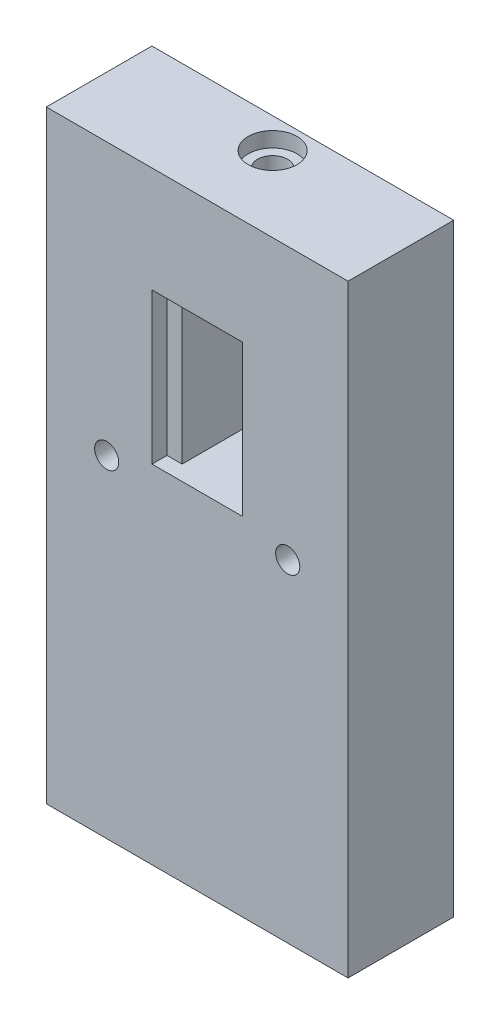
ISO-10303-21;
HEADER;
FILE_DESCRIPTION(('STEP AP214'),'2;1');
FILE_NAME('part.step','',(''),(''),'','','');
FILE_SCHEMA(('AUTOMOTIVE_DESIGN { 1 0 10303 214 1 1 1 1 }'));
ENDSEC;
DATA;
#1=APPLICATION_CONTEXT('core data for automotive mechanical design processes');
#2=APPLICATION_PROTOCOL_DEFINITION('international standard','automotive_design',2000,#1);
#3=PRODUCT_CONTEXT('',#1,'mechanical');
#4=PRODUCT('Part','Part','',(#3));
#5=PRODUCT_RELATED_PRODUCT_CATEGORY('part','',(#4));
#6=PRODUCT_DEFINITION_FORMATION('','',#4);
#7=PRODUCT_DEFINITION_CONTEXT('part definition',#1,'design');
#8=PRODUCT_DEFINITION('design','',#6,#7);
#9=PRODUCT_DEFINITION_SHAPE('','',#8);
#10=(LENGTH_UNIT() NAMED_UNIT(*) SI_UNIT(.MILLI.,.METRE.));
#11=(NAMED_UNIT(*) PLANE_ANGLE_UNIT() SI_UNIT($,.RADIAN.));
#12=(NAMED_UNIT(*) SI_UNIT($,.STERADIAN.) SOLID_ANGLE_UNIT());
#13=UNCERTAINTY_MEASURE_WITH_UNIT(LENGTH_MEASURE(1.E-05),#10,'distance_accuracy_value','');
#14=(GEOMETRIC_REPRESENTATION_CONTEXT(3) GLOBAL_UNCERTAINTY_ASSIGNED_CONTEXT((#13)) GLOBAL_UNIT_ASSIGNED_CONTEXT((#10,
#11,#12)) REPRESENTATION_CONTEXT('',''));
#15=CARTESIAN_POINT('',(0.,0.,0.));
#16=DIRECTION('',(0.,0.,1.));
#17=DIRECTION('',(1.,0.,0.));
#18=AXIS2_PLACEMENT_3D('',#15,#16,#17);
#19=CARTESIAN_POINT('',(0.,-100.,10.));
#20=DIRECTION('',(0.,1.,0.));
#21=DIRECTION('',(0.,0.,1.));
#22=AXIS2_PLACEMENT_3D('',#19,#20,#21);
#23=CYLINDRICAL_SURFACE('',#22,5.);
#24=CARTESIAN_POINT('',(0.,15.,10.));
#25=DIRECTION('',(0.,-1.,0.));
#26=DIRECTION('',(1.,0.,0.));
#27=AXIS2_PLACEMENT_3D('',#24,#25,#26);
#28=CIRCLE('',#27,5.);
#29=CARTESIAN_POINT('',(5.,15.,10.));
#30=VERTEX_POINT('',#29);
#31=EDGE_CURVE('E212',#30,#30,#28,.F.);
#32=ORIENTED_EDGE('',*,*,#31,.T.);
#33=EDGE_LOOP('',(#32));
#34=FACE_BOUND('',#33,.T.);
#35=CARTESIAN_POINT('',(0.,-94.9999999999999,10.));
#36=DIRECTION('',(0.,-1.,0.));
#37=DIRECTION('',(0.,0.,-1.));
#38=AXIS2_PLACEMENT_3D('',#35,#36,#37);
#39=CIRCLE('',#38,5.);
#40=CARTESIAN_POINT('',(0.,-94.9999999999999,5.));
#41=VERTEX_POINT('',#40);
#42=EDGE_CURVE('E166',#41,#41,#39,.F.);
#43=ORIENTED_EDGE('',*,*,#42,.F.);
#44=EDGE_LOOP('',(#43));
#45=FACE_BOUND('',#44,.T.);
#46=ADVANCED_FACE('F33',(#34,#45),#23,.F.);
#47=CARTESIAN_POINT('',(0.,65.,10.));
#48=DIRECTION('',(0.,1.,0.));
#49=DIRECTION('',(0.,0.,1.));
#50=AXIS2_PLACEMENT_3D('',#47,#48,#49);
#51=CIRCLE('',#50,5.);
#52=CARTESIAN_POINT('',(0.,65.,15.));
#53=VERTEX_POINT('',#52);
#54=EDGE_CURVE('E193',#53,#53,#51,.F.);
#55=ORIENTED_EDGE('',*,*,#54,.T.);
#56=EDGE_LOOP('',(#55));
#57=FACE_BOUND('',#56,.T.);
#58=CARTESIAN_POINT('',(0.,94.9999999999999,10.));
#59=DIRECTION('',(0.,1.,0.));
#60=DIRECTION('',(0.,0.,1.));
#61=AXIS2_PLACEMENT_3D('',#58,#59,#60);
#62=CIRCLE('',#61,5.);
#63=CARTESIAN_POINT('',(0.,94.9999999999999,15.));
#64=VERTEX_POINT('',#63);
#65=EDGE_CURVE('E172',#64,#64,#62,.F.);
#66=ORIENTED_EDGE('',*,*,#65,.F.);
#67=EDGE_LOOP('',(#66));
#68=FACE_BOUND('',#67,.T.);
#69=ADVANCED_FACE('F252',(#57,#68),#23,.F.);
#70=CARTESIAN_POINT('',(50.,99.9999999999999,35.));
#71=DIRECTION('',(-1.,0.,0.));
#72=DIRECTION('',(0.,-1.,0.));
#73=AXIS2_PLACEMENT_3D('',#70,#71,#72);
#74=PLANE('',#73);
#75=DIRECTION('',(0.,1.,0.));
#76=VECTOR('',#75,1.);
#77=CARTESIAN_POINT('',(50.,99.9999999999999,0.));
#78=LINE('',#77,#76);
#79=CARTESIAN_POINT('',(50.,-100.,0.));
#80=VERTEX_POINT('',#79);
#81=CARTESIAN_POINT('',(50.,99.9999999999999,0.));
#82=VERTEX_POINT('',#81);
#83=EDGE_CURVE('E202',#80,#82,#78,.T.);
#84=ORIENTED_EDGE('',*,*,#83,.T.);
#85=DIRECTION('',(0.,0.,-1.));
#86=VECTOR('',#85,1.);
#87=CARTESIAN_POINT('',(50.,99.9999999999999,35.));
#88=LINE('',#87,#86);
#89=CARTESIAN_POINT('',(50.,99.9999999999999,35.));
#90=VERTEX_POINT('',#89);
#91=EDGE_CURVE('E41',#90,#82,#88,.T.);
#92=ORIENTED_EDGE('',*,*,#91,.F.);
#93=DIRECTION('',(0.,1.,0.));
#94=VECTOR('',#93,1.);
#95=CARTESIAN_POINT('',(50.,99.9999999999999,35.));
#96=LINE('',#95,#94);
#97=CARTESIAN_POINT('',(50.,-100.,35.));
#98=VERTEX_POINT('',#97);
#99=EDGE_CURVE('E213',#98,#90,#96,.T.);
#100=ORIENTED_EDGE('',*,*,#99,.F.);
#101=DIRECTION('',(0.,0.,-1.));
#102=VECTOR('',#101,1.);
#103=CARTESIAN_POINT('',(50.,-100.,35.));
#104=LINE('',#103,#102);
#105=EDGE_CURVE('E223',#98,#80,#104,.T.);
#106=ORIENTED_EDGE('',*,*,#105,.T.);
#107=EDGE_LOOP('',(#84,#92,#100,#106));
#108=FACE_BOUND('',#107,.T.);
#109=ADVANCED_FACE('F35',(#108),#74,.F.);
#110=CARTESIAN_POINT('',(-50.,99.9999999999999,35.));
#111=DIRECTION('',(0.,-1.,0.));
#112=DIRECTION('',(0.,0.,-1.));
#113=AXIS2_PLACEMENT_3D('',#110,#111,#112);
#114=PLANE('',#113);
#115=CARTESIAN_POINT('',(0.,99.9999999999999,10.));
#116=DIRECTION('',(0.,1.,0.));
#117=DIRECTION('',(0.,0.,1.));
#118=AXIS2_PLACEMENT_3D('',#115,#116,#117);
#119=CIRCLE('',#118,8.1);
#120=CARTESIAN_POINT('',(0.,99.9999999999999,18.1));
#121=VERTEX_POINT('',#120);
#122=EDGE_CURVE('E173',#121,#121,#119,.T.);
#123=ORIENTED_EDGE('',*,*,#122,.F.);
#124=EDGE_LOOP('',(#123));
#125=FACE_BOUND('',#124,.T.);
#126=DIRECTION('',(-1.,0.,0.));
#127=VECTOR('',#126,1.);
#128=CARTESIAN_POINT('',(-50.,99.9999999999999,0.));
#129=LINE('',#128,#127);
#130=CARTESIAN_POINT('',(-50.,99.9999999999999,0.));
#131=VERTEX_POINT('',#130);
#132=EDGE_CURVE('E226',#82,#131,#129,.T.);
#133=ORIENTED_EDGE('',*,*,#132,.T.);
#134=DIRECTION('',(0.,0.,-1.));
#135=VECTOR('',#134,1.);
#136=CARTESIAN_POINT('',(-50.,99.9999999999999,35.));
#137=LINE('',#136,#135);
#138=CARTESIAN_POINT('',(-50.,99.9999999999999,35.));
#139=VERTEX_POINT('',#138);
#140=EDGE_CURVE('E236',#139,#131,#137,.T.);
#141=ORIENTED_EDGE('',*,*,#140,.F.);
#142=DIRECTION('',(-1.,0.,0.));
#143=VECTOR('',#142,1.);
#144=CARTESIAN_POINT('',(-50.,99.9999999999999,35.));
#145=LINE('',#144,#143);
#146=EDGE_CURVE('E216',#90,#139,#145,.T.);
#147=ORIENTED_EDGE('',*,*,#146,.F.);
#148=ORIENTED_EDGE('',*,*,#91,.T.);
#149=EDGE_LOOP('',(#133,#141,#147,#148));
#150=FACE_BOUND('',#149,.T.);
#151=ADVANCED_FACE('F293',(#125,#150),#114,.F.);
#152=CARTESIAN_POINT('',(-50.,99.9999999999999,35.));
#153=DIRECTION('',(1.,0.,0.));
#154=DIRECTION('',(0.,1.,0.));
#155=AXIS2_PLACEMENT_3D('',#152,#153,#154);
#156=PLANE('',#155);
#157=DIRECTION('',(0.,-1.,0.));
#158=VECTOR('',#157,1.);
#159=CARTESIAN_POINT('',(-50.,99.9999999999999,0.));
#160=LINE('',#159,#158);
#161=CARTESIAN_POINT('',(-50.,-100.,0.));
#162=VERTEX_POINT('',#161);
#163=EDGE_CURVE('E228',#131,#162,#160,.T.);
#164=ORIENTED_EDGE('',*,*,#163,.T.);
#165=DIRECTION('',(0.,0.,-1.));
#166=VECTOR('',#165,1.);
#167=CARTESIAN_POINT('',(-50.,-100.,35.));
#168=LINE('',#167,#166);
#169=CARTESIAN_POINT('',(-50.,-100.,35.));
#170=VERTEX_POINT('',#169);
#171=EDGE_CURVE('E233',#170,#162,#168,.T.);
#172=ORIENTED_EDGE('',*,*,#171,.F.);
#173=DIRECTION('',(0.,-1.,0.));
#174=VECTOR('',#173,1.);
#175=CARTESIAN_POINT('',(-50.,99.9999999999999,35.));
#176=LINE('',#175,#174);
#177=EDGE_CURVE('E219',#139,#170,#176,.T.);
#178=ORIENTED_EDGE('',*,*,#177,.F.);
#179=ORIENTED_EDGE('',*,*,#140,.T.);
#180=EDGE_LOOP('',(#164,#172,#178,#179));
#181=FACE_BOUND('',#180,.T.);
#182=ADVANCED_FACE('F290',(#181),#156,.F.);
#183=CARTESIAN_POINT('',(-50.,-100.,35.));
#184=DIRECTION('',(0.,1.,0.));
#185=DIRECTION('',(0.,0.,1.));
#186=AXIS2_PLACEMENT_3D('',#183,#184,#185);
#187=PLANE('',#186);
#188=CARTESIAN_POINT('',(0.,-99.9999999999999,10.));
#189=DIRECTION('',(0.,1.,0.));
#190=DIRECTION('',(0.,0.,1.));
#191=AXIS2_PLACEMENT_3D('',#188,#189,#190);
#192=CIRCLE('',#191,8.1);
#193=CARTESIAN_POINT('',(0.,-99.9999999999999,18.1));
#194=VERTEX_POINT('',#193);
#195=EDGE_CURVE('E162',#194,#194,#192,.T.);
#196=ORIENTED_EDGE('',*,*,#195,.T.);
#197=EDGE_LOOP('',(#196));
#198=FACE_BOUND('',#197,.T.);
#199=DIRECTION('',(1.,0.,0.));
#200=VECTOR('',#199,1.);
#201=CARTESIAN_POINT('',(-50.,-100.,0.));
#202=LINE('',#201,#200);
#203=EDGE_CURVE('E217',#162,#80,#202,.T.);
#204=ORIENTED_EDGE('',*,*,#203,.T.);
#205=ORIENTED_EDGE('',*,*,#105,.F.);
#206=DIRECTION('',(1.,0.,0.));
#207=VECTOR('',#206,1.);
#208=CARTESIAN_POINT('',(-50.,-100.,35.));
#209=LINE('',#208,#207);
#210=EDGE_CURVE('E221',#170,#98,#209,.T.);
#211=ORIENTED_EDGE('',*,*,#210,.F.);
#212=ORIENTED_EDGE('',*,*,#171,.T.);
#213=EDGE_LOOP('',(#204,#205,#211,#212));
#214=FACE_BOUND('',#213,.T.);
#215=ADVANCED_FACE('F283',(#198,#214),#187,.F.);
#216=CARTESIAN_POINT('',(0.,0.,35.));
#217=DIRECTION('',(0.,0.,1.));
#218=DIRECTION('',(1.,0.,0.));
#219=AXIS2_PLACEMENT_3D('',#216,#217,#218);
#220=PLANE('',#219);
#221=DIRECTION('',(0.,-1.,0.));
#222=VECTOR('',#221,1.);
#223=CARTESIAN_POINT('',(-15.,15.,35.));
#224=LINE('',#223,#222);
#225=CARTESIAN_POINT('',(-15.,65.,35.));
#226=VERTEX_POINT('',#225);
#227=CARTESIAN_POINT('',(-15.,15.,35.));
#228=VERTEX_POINT('',#227);
#229=EDGE_CURVE('E129',#226,#228,#224,.T.);
#230=ORIENTED_EDGE('',*,*,#229,.F.);
#231=DIRECTION('',(1.,0.,0.));
#232=VECTOR('',#231,1.);
#233=CARTESIAN_POINT('',(10.,65.,35.));
#234=LINE('',#233,#232);
#235=CARTESIAN_POINT('',(15.,65.,35.));
#236=VERTEX_POINT('',#235);
#237=EDGE_CURVE('E176',#226,#236,#234,.T.);
#238=ORIENTED_EDGE('',*,*,#237,.T.);
#239=DIRECTION('',(0.,1.,0.));
#240=VECTOR('',#239,1.);
#241=CARTESIAN_POINT('',(15.,15.,35.));
#242=LINE('',#241,#240);
#243=CARTESIAN_POINT('',(15.,15.,35.));
#244=VERTEX_POINT('',#243);
#245=EDGE_CURVE('E145',#244,#236,#242,.T.);
#246=ORIENTED_EDGE('',*,*,#245,.F.);
#247=DIRECTION('',(-1.,0.,0.));
#248=VECTOR('',#247,1.);
#249=CARTESIAN_POINT('',(9.99999999999999,15.,35.));
#250=LINE('',#249,#248);
#251=EDGE_CURVE('E178',#244,#228,#250,.T.);
#252=ORIENTED_EDGE('',*,*,#251,.T.);
#253=EDGE_LOOP('',(#230,#238,#246,#252));
#254=FACE_BOUND('',#253,.T.);
#255=CARTESIAN_POINT('',(-30.,10.,35.));
#256=DIRECTION('',(0.,0.,1.));
#257=DIRECTION('',(1.,0.,0.));
#258=AXIS2_PLACEMENT_3D('',#255,#256,#257);
#259=CIRCLE('',#258,4.);
#260=CARTESIAN_POINT('',(-26.,10.,35.));
#261=VERTEX_POINT('',#260);
#262=EDGE_CURVE('E203',#261,#261,#259,.T.);
#263=ORIENTED_EDGE('',*,*,#262,.F.);
#264=EDGE_LOOP('',(#263));
#265=FACE_BOUND('',#264,.T.);
#266=CARTESIAN_POINT('',(30.,10.,35.));
#267=DIRECTION('',(0.,0.,1.));
#268=DIRECTION('',(1.,0.,0.));
#269=AXIS2_PLACEMENT_3D('',#266,#267,#268);
#270=CIRCLE('',#269,4.00000000000001);
#271=CARTESIAN_POINT('',(34.,10.,35.));
#272=VERTEX_POINT('',#271);
#273=EDGE_CURVE('E209',#272,#272,#270,.T.);
#274=ORIENTED_EDGE('',*,*,#273,.F.);
#275=EDGE_LOOP('',(#274));
#276=FACE_BOUND('',#275,.T.);
#277=ORIENTED_EDGE('',*,*,#99,.T.);
#278=ORIENTED_EDGE('',*,*,#146,.T.);
#279=ORIENTED_EDGE('',*,*,#177,.T.);
#280=ORIENTED_EDGE('',*,*,#210,.T.);
#281=EDGE_LOOP('',(#277,#278,#279,#280));
#282=FACE_BOUND('',#281,.T.);
#283=ADVANCED_FACE('F280',(#254,#265,#276,#282),#220,.T.);
#284=CARTESIAN_POINT('',(0.,0.,0.));
#285=DIRECTION('',(0.,0.,1.));
#286=DIRECTION('',(1.,0.,0.));
#287=AXIS2_PLACEMENT_3D('',#284,#285,#286);
#288=PLANE('',#287);
#289=DIRECTION('',(1.,0.,0.));
#290=VECTOR('',#289,1.);
#291=CARTESIAN_POINT('',(10.,65.,0.));
#292=LINE('',#291,#290);
#293=CARTESIAN_POINT('',(-10.,65.,0.));
#294=VERTEX_POINT('',#293);
#295=CARTESIAN_POINT('',(10.,65.,0.));
#296=VERTEX_POINT('',#295);
#297=EDGE_CURVE('E185',#294,#296,#292,.T.);
#298=ORIENTED_EDGE('',*,*,#297,.F.);
#299=DIRECTION('',(0.,1.,0.));
#300=VECTOR('',#299,1.);
#301=CARTESIAN_POINT('',(-10.,65.,0.));
#302=LINE('',#301,#300);
#303=CARTESIAN_POINT('',(-10.,15.,0.));
#304=VERTEX_POINT('',#303);
#305=EDGE_CURVE('E182',#304,#294,#302,.T.);
#306=ORIENTED_EDGE('',*,*,#305,.F.);
#307=DIRECTION('',(-1.,0.,0.));
#308=VECTOR('',#307,1.);
#309=CARTESIAN_POINT('',(9.99999999999999,15.,0.));
#310=LINE('',#309,#308);
#311=CARTESIAN_POINT('',(9.99999999999999,15.,0.));
#312=VERTEX_POINT('',#311);
#313=EDGE_CURVE('E179',#312,#304,#310,.T.);
#314=ORIENTED_EDGE('',*,*,#313,.F.);
#315=DIRECTION('',(0.,-1.,0.));
#316=VECTOR('',#315,1.);
#317=CARTESIAN_POINT('',(10.,65.,0.));
#318=LINE('',#317,#316);
#319=EDGE_CURVE('E188',#296,#312,#318,.T.);
#320=ORIENTED_EDGE('',*,*,#319,.F.);
#321=EDGE_LOOP('',(#298,#306,#314,#320));
#322=FACE_BOUND('',#321,.T.);
#323=ORIENTED_EDGE('',*,*,#83,.F.);
#324=ORIENTED_EDGE('',*,*,#203,.F.);
#325=ORIENTED_EDGE('',*,*,#163,.F.);
#326=ORIENTED_EDGE('',*,*,#132,.F.);
#327=EDGE_LOOP('',(#323,#324,#325,#326));
#328=FACE_BOUND('',#327,.T.);
#329=ADVANCED_FACE('F278',(#322,#328),#288,.F.);
#330=CARTESIAN_POINT('',(30.,10.,5.));
#331=DIRECTION('',(0.,0.,1.));
#332=DIRECTION('',(1.,0.,0.));
#333=AXIS2_PLACEMENT_3D('',#330,#331,#332);
#334=CYLINDRICAL_SURFACE('',#333,4.00000000000001);
#335=CARTESIAN_POINT('',(30.,10.,5.));
#336=DIRECTION('',(0.,0.,1.));
#337=DIRECTION('',(1.,0.,0.));
#338=AXIS2_PLACEMENT_3D('',#335,#336,#337);
#339=CIRCLE('',#338,4.00000000000001);
#340=CARTESIAN_POINT('',(34.,10.,5.));
#341=VERTEX_POINT('',#340);
#342=EDGE_CURVE('E206',#341,#341,#339,.T.);
#343=ORIENTED_EDGE('',*,*,#342,.F.);
#344=EDGE_LOOP('',(#343));
#345=FACE_BOUND('',#344,.T.);
#346=ORIENTED_EDGE('',*,*,#273,.T.);
#347=EDGE_LOOP('',(#346));
#348=FACE_BOUND('',#347,.T.);
#349=ADVANCED_FACE('F274',(#345,#348),#334,.F.);
#350=CARTESIAN_POINT('',(30.,10.,5.));
#351=DIRECTION('',(0.,0.,1.));
#352=DIRECTION('',(1.,0.,0.));
#353=AXIS2_PLACEMENT_3D('',#350,#351,#352);
#354=PLANE('',#353);
#355=ORIENTED_EDGE('',*,*,#342,.T.);
#356=EDGE_LOOP('',(#355));
#357=FACE_BOUND('',#356,.T.);
#358=ADVANCED_FACE('F270',(#357),#354,.T.);
#359=CARTESIAN_POINT('',(-30.,10.,5.));
#360=DIRECTION('',(0.,0.,1.));
#361=DIRECTION('',(1.,0.,0.));
#362=AXIS2_PLACEMENT_3D('',#359,#360,#361);
#363=CYLINDRICAL_SURFACE('',#362,4.);
#364=CARTESIAN_POINT('',(-30.,10.,5.));
#365=DIRECTION('',(0.,0.,1.));
#366=DIRECTION('',(1.,0.,0.));
#367=AXIS2_PLACEMENT_3D('',#364,#365,#366);
#368=CIRCLE('',#367,4.);
#369=CARTESIAN_POINT('',(-26.,10.,5.));
#370=VERTEX_POINT('',#369);
#371=EDGE_CURVE('E199',#370,#370,#368,.T.);
#372=ORIENTED_EDGE('',*,*,#371,.F.);
#373=EDGE_LOOP('',(#372));
#374=FACE_BOUND('',#373,.T.);
#375=ORIENTED_EDGE('',*,*,#262,.T.);
#376=EDGE_LOOP('',(#375));
#377=FACE_BOUND('',#376,.T.);
#378=ADVANCED_FACE('F266',(#374,#377),#363,.F.);
#379=CARTESIAN_POINT('',(-30.,10.,5.));
#380=DIRECTION('',(0.,0.,1.));
#381=DIRECTION('',(1.,0.,0.));
#382=AXIS2_PLACEMENT_3D('',#379,#380,#381);
#383=PLANE('',#382);
#384=ORIENTED_EDGE('',*,*,#371,.T.);
#385=EDGE_LOOP('',(#384));
#386=FACE_BOUND('',#385,.T.);
#387=ADVANCED_FACE('F263',(#386),#383,.T.);
#388=CARTESIAN_POINT('',(9.99999999999999,15.,35.));
#389=DIRECTION('',(0.,-1.,0.));
#390=DIRECTION('',(1.,0.,0.));
#391=AXIS2_PLACEMENT_3D('',#388,#389,#390);
#392=PLANE('',#391);
#393=DIRECTION('',(0.,0.,-1.));
#394=VECTOR('',#393,1.);
#395=CARTESIAN_POINT('',(-10.,15.,35.));
#396=LINE('',#395,#394);
#397=CARTESIAN_POINT('',(-10.,15.,30.));
#398=VERTEX_POINT('',#397);
#399=EDGE_CURVE('E137',#398,#304,#396,.T.);
#400=ORIENTED_EDGE('',*,*,#399,.F.);
#401=DIRECTION('',(1.,0.,0.));
#402=VECTOR('',#401,1.);
#403=CARTESIAN_POINT('',(-15.,15.,30.));
#404=LINE('',#403,#402);
#405=CARTESIAN_POINT('',(-15.,15.,30.));
#406=VERTEX_POINT('',#405);
#407=EDGE_CURVE('E48',#406,#398,#404,.T.);
#408=ORIENTED_EDGE('',*,*,#407,.F.);
#409=DIRECTION('',(0.,0.,1.));
#410=VECTOR('',#409,1.);
#411=CARTESIAN_POINT('',(-15.,15.,30.));
#412=LINE('',#411,#410);
#413=EDGE_CURVE('E124',#406,#228,#412,.T.);
#414=ORIENTED_EDGE('',*,*,#413,.T.);
#415=ORIENTED_EDGE('',*,*,#251,.F.);
#416=DIRECTION('',(0.,0.,1.));
#417=VECTOR('',#416,1.);
#418=CARTESIAN_POINT('',(15.,15.,30.));
#419=LINE('',#418,#417);
#420=CARTESIAN_POINT('',(15.,15.,30.));
#421=VERTEX_POINT('',#420);
#422=EDGE_CURVE('E131',#421,#244,#419,.T.);
#423=ORIENTED_EDGE('',*,*,#422,.F.);
#424=CARTESIAN_POINT('',(9.99999999999999,15.,30.));
#425=VERTEX_POINT('',#424);
#426=EDGE_CURVE('E139',#425,#421,#404,.T.);
#427=ORIENTED_EDGE('',*,*,#426,.F.);
#428=DIRECTION('',(0.,0.,-1.));
#429=VECTOR('',#428,1.);
#430=CARTESIAN_POINT('',(9.99999999999999,15.,35.));
#431=LINE('',#430,#429);
#432=EDGE_CURVE('E194',#425,#312,#431,.T.);
#433=ORIENTED_EDGE('',*,*,#432,.T.);
#434=ORIENTED_EDGE('',*,*,#313,.T.);
#435=EDGE_LOOP('',(#400,#408,#414,#415,#423,#427,#433,#434));
#436=FACE_BOUND('',#435,.T.);
#437=ORIENTED_EDGE('',*,*,#31,.F.);
#438=EDGE_LOOP('',(#437));
#439=FACE_BOUND('',#438,.T.);
#440=ADVANCED_FACE('F134',(#436,#439),#392,.F.);
#441=CARTESIAN_POINT('',(10.,65.,35.));
#442=DIRECTION('',(0.,1.,0.));
#443=DIRECTION('',(0.,0.,1.));
#444=AXIS2_PLACEMENT_3D('',#441,#442,#443);
#445=PLANE('',#444);
#446=DIRECTION('',(0.,0.,-1.));
#447=VECTOR('',#446,1.);
#448=CARTESIAN_POINT('',(10.,65.,35.));
#449=LINE('',#448,#447);
#450=CARTESIAN_POINT('',(10.,65.,30.));
#451=VERTEX_POINT('',#450);
#452=EDGE_CURVE('E196',#451,#296,#449,.T.);
#453=ORIENTED_EDGE('',*,*,#452,.F.);
#454=DIRECTION('',(-1.,0.,0.));
#455=VECTOR('',#454,1.);
#456=CARTESIAN_POINT('',(-15.,65.,30.));
#457=LINE('',#456,#455);
#458=CARTESIAN_POINT('',(15.,65.,30.));
#459=VERTEX_POINT('',#458);
#460=EDGE_CURVE('E56',#459,#451,#457,.T.);
#461=ORIENTED_EDGE('',*,*,#460,.F.);
#462=DIRECTION('',(0.,0.,1.));
#463=VECTOR('',#462,1.);
#464=CARTESIAN_POINT('',(15.,65.,30.));
#465=LINE('',#464,#463);
#466=EDGE_CURVE('E156',#459,#236,#465,.T.);
#467=ORIENTED_EDGE('',*,*,#466,.T.);
#468=ORIENTED_EDGE('',*,*,#237,.F.);
#469=DIRECTION('',(0.,0.,1.));
#470=VECTOR('',#469,1.);
#471=CARTESIAN_POINT('',(-15.,65.,30.));
#472=LINE('',#471,#470);
#473=CARTESIAN_POINT('',(-15.,65.,30.));
#474=VERTEX_POINT('',#473);
#475=EDGE_CURVE('E153',#474,#226,#472,.T.);
#476=ORIENTED_EDGE('',*,*,#475,.F.);
#477=CARTESIAN_POINT('',(-10.,65.,30.));
#478=VERTEX_POINT('',#477);
#479=EDGE_CURVE('E143',#478,#474,#457,.T.);
#480=ORIENTED_EDGE('',*,*,#479,.F.);
#481=DIRECTION('',(0.,0.,-1.));
#482=VECTOR('',#481,1.);
#483=CARTESIAN_POINT('',(-10.,65.,35.));
#484=LINE('',#483,#482);
#485=EDGE_CURVE('E181',#478,#294,#484,.T.);
#486=ORIENTED_EDGE('',*,*,#485,.T.);
#487=ORIENTED_EDGE('',*,*,#297,.T.);
#488=EDGE_LOOP('',(#453,#461,#467,#468,#476,#480,#486,#487));
#489=FACE_BOUND('',#488,.T.);
#490=ORIENTED_EDGE('',*,*,#54,.F.);
#491=EDGE_LOOP('',(#490));
#492=FACE_BOUND('',#491,.T.);
#493=ADVANCED_FACE('F337',(#489,#492),#445,.F.);
#494=CARTESIAN_POINT('',(-10.,65.,35.));
#495=DIRECTION('',(-1.,0.,0.));
#496=DIRECTION('',(0.,-1.,0.));
#497=AXIS2_PLACEMENT_3D('',#494,#495,#496);
#498=PLANE('',#497);
#499=ORIENTED_EDGE('',*,*,#485,.F.);
#500=DIRECTION('',(0.,-1.,0.));
#501=VECTOR('',#500,1.);
#502=CARTESIAN_POINT('',(-10.,65.,30.));
#503=LINE('',#502,#501);
#504=EDGE_CURVE('E155',#478,#398,#503,.T.);
#505=ORIENTED_EDGE('',*,*,#504,.T.);
#506=ORIENTED_EDGE('',*,*,#399,.T.);
#507=ORIENTED_EDGE('',*,*,#305,.T.);
#508=EDGE_LOOP('',(#499,#505,#506,#507));
#509=FACE_BOUND('',#508,.T.);
#510=ADVANCED_FACE('F261',(#509),#498,.F.);
#511=CARTESIAN_POINT('',(10.,65.,35.));
#512=DIRECTION('',(1.,0.,0.));
#513=DIRECTION('',(0.,1.,0.));
#514=AXIS2_PLACEMENT_3D('',#511,#512,#513);
#515=PLANE('',#514);
#516=ORIENTED_EDGE('',*,*,#432,.F.);
#517=DIRECTION('',(0.,1.,0.));
#518=VECTOR('',#517,1.);
#519=CARTESIAN_POINT('',(10.,65.,30.));
#520=LINE('',#519,#518);
#521=EDGE_CURVE('E11',#425,#451,#520,.T.);
#522=ORIENTED_EDGE('',*,*,#521,.T.);
#523=ORIENTED_EDGE('',*,*,#452,.T.);
#524=ORIENTED_EDGE('',*,*,#319,.T.);
#525=EDGE_LOOP('',(#516,#522,#523,#524));
#526=FACE_BOUND('',#525,.T.);
#527=ADVANCED_FACE('F329',(#526),#515,.F.);
#528=CARTESIAN_POINT('',(0.,94.9999999999999,10.));
#529=DIRECTION('',(0.,1.,0.));
#530=DIRECTION('',(0.,0.,1.));
#531=AXIS2_PLACEMENT_3D('',#528,#529,#530);
#532=PLANE('',#531);
#533=CARTESIAN_POINT('',(0.,94.9999999999999,10.));
#534=DIRECTION('',(0.,1.,0.));
#535=DIRECTION('',(0.,0.,1.));
#536=AXIS2_PLACEMENT_3D('',#533,#534,#535);
#537=CIRCLE('',#536,8.1);
#538=CARTESIAN_POINT('',(0.,94.9999999999999,18.1));
#539=VERTEX_POINT('',#538);
#540=EDGE_CURVE('E169',#539,#539,#537,.T.);
#541=ORIENTED_EDGE('',*,*,#540,.T.);
#542=EDGE_LOOP('',(#541));
#543=FACE_BOUND('',#542,.T.);
#544=ORIENTED_EDGE('',*,*,#65,.T.);
#545=EDGE_LOOP('',(#544));
#546=FACE_BOUND('',#545,.T.);
#547=ADVANCED_FACE('F319',(#543,#546),#532,.T.);
#548=CARTESIAN_POINT('',(0.,94.9999999999999,10.));
#549=DIRECTION('',(0.,1.,0.));
#550=DIRECTION('',(0.,0.,1.));
#551=AXIS2_PLACEMENT_3D('',#548,#549,#550);
#552=CYLINDRICAL_SURFACE('',#551,8.1);
#553=ORIENTED_EDGE('',*,*,#540,.F.);
#554=EDGE_LOOP('',(#553));
#555=FACE_BOUND('',#554,.T.);
#556=ORIENTED_EDGE('',*,*,#122,.T.);
#557=EDGE_LOOP('',(#556));
#558=FACE_BOUND('',#557,.T.);
#559=ADVANCED_FACE('F317',(#555,#558),#552,.F.);
#560=CARTESIAN_POINT('',(0.,-94.9999999999999,10.));
#561=DIRECTION('',(0.,-1.,0.));
#562=DIRECTION('',(0.,0.,1.));
#563=AXIS2_PLACEMENT_3D('',#560,#561,#562);
#564=PLANE('',#563);
#565=CARTESIAN_POINT('',(0.,-94.9999999999999,10.));
#566=DIRECTION('',(0.,1.,0.));
#567=DIRECTION('',(0.,0.,1.));
#568=AXIS2_PLACEMENT_3D('',#565,#566,#567);
#569=CIRCLE('',#568,8.1);
#570=CARTESIAN_POINT('',(0.,-94.9999999999999,18.1));
#571=VERTEX_POINT('',#570);
#572=EDGE_CURVE('E163',#571,#571,#569,.T.);
#573=ORIENTED_EDGE('',*,*,#572,.F.);
#574=EDGE_LOOP('',(#573));
#575=FACE_BOUND('',#574,.T.);
#576=ORIENTED_EDGE('',*,*,#42,.T.);
#577=EDGE_LOOP('',(#576));
#578=FACE_BOUND('',#577,.T.);
#579=ADVANCED_FACE('F249',(#575,#578),#564,.T.);
#580=CARTESIAN_POINT('',(0.,-94.9999999999999,10.));
#581=DIRECTION('',(0.,-1.,0.));
#582=DIRECTION('',(0.,0.,-1.));
#583=AXIS2_PLACEMENT_3D('',#580,#581,#582);
#584=CYLINDRICAL_SURFACE('',#583,8.1);
#585=ORIENTED_EDGE('',*,*,#572,.T.);
#586=EDGE_LOOP('',(#585));
#587=FACE_BOUND('',#586,.T.);
#588=ORIENTED_EDGE('',*,*,#195,.F.);
#589=EDGE_LOOP('',(#588));
#590=FACE_BOUND('',#589,.T.);
#591=ADVANCED_FACE('F326',(#587,#590),#584,.F.);
#592=CARTESIAN_POINT('',(0.,0.,30.));
#593=DIRECTION('',(0.,0.,-1.));
#594=DIRECTION('',(-1.,0.,0.));
#595=AXIS2_PLACEMENT_3D('',#592,#593,#594);
#596=PLANE('',#595);
#597=ORIENTED_EDGE('',*,*,#426,.T.);
#598=DIRECTION('',(0.,1.,0.));
#599=VECTOR('',#598,1.);
#600=CARTESIAN_POINT('',(15.,15.,30.));
#601=LINE('',#600,#599);
#602=EDGE_CURVE('E138',#421,#459,#601,.T.);
#603=ORIENTED_EDGE('',*,*,#602,.T.);
#604=ORIENTED_EDGE('',*,*,#460,.T.);
#605=ORIENTED_EDGE('',*,*,#521,.F.);
#606=EDGE_LOOP('',(#597,#603,#604,#605));
#607=FACE_BOUND('',#606,.T.);
#608=ADVANCED_FACE('F357',(#607),#596,.F.);
#609=CARTESIAN_POINT('',(15.,15.,30.));
#610=DIRECTION('',(1.,0.,0.));
#611=DIRECTION('',(0.,0.,-1.));
#612=AXIS2_PLACEMENT_3D('',#609,#610,#611);
#613=PLANE('',#612);
#614=ORIENTED_EDGE('',*,*,#245,.T.);
#615=ORIENTED_EDGE('',*,*,#466,.F.);
#616=ORIENTED_EDGE('',*,*,#602,.F.);
#617=ORIENTED_EDGE('',*,*,#422,.T.);
#618=EDGE_LOOP('',(#614,#615,#616,#617));
#619=FACE_BOUND('',#618,.T.);
#620=ADVANCED_FACE('F362',(#619),#613,.F.);
#621=ORIENTED_EDGE('',*,*,#479,.T.);
#622=DIRECTION('',(0.,-1.,0.));
#623=VECTOR('',#622,1.);
#624=CARTESIAN_POINT('',(-15.,15.,30.));
#625=LINE('',#624,#623);
#626=EDGE_CURVE('E127',#474,#406,#625,.T.);
#627=ORIENTED_EDGE('',*,*,#626,.T.);
#628=ORIENTED_EDGE('',*,*,#407,.T.);
#629=ORIENTED_EDGE('',*,*,#504,.F.);
#630=EDGE_LOOP('',(#621,#627,#628,#629));
#631=FACE_BOUND('',#630,.T.);
#632=ADVANCED_FACE('F141',(#631),#596,.F.);
#633=CARTESIAN_POINT('',(-15.,15.,30.));
#634=DIRECTION('',(-1.,0.,0.));
#635=DIRECTION('',(0.,0.,1.));
#636=AXIS2_PLACEMENT_3D('',#633,#634,#635);
#637=PLANE('',#636);
#638=ORIENTED_EDGE('',*,*,#229,.T.);
#639=ORIENTED_EDGE('',*,*,#413,.F.);
#640=ORIENTED_EDGE('',*,*,#626,.F.);
#641=ORIENTED_EDGE('',*,*,#475,.T.);
#642=EDGE_LOOP('',(#638,#639,#640,#641));
#643=FACE_BOUND('',#642,.T.);
#644=ADVANCED_FACE('F125',(#643),#637,.F.);
#645=CLOSED_SHELL('',(#46,#69,#109,#151,#182,#215,#283,#329,#349,#358,#378,#387,#440,#493,#510,
#527,#547,#559,#579,#591,#608,#620,#632,#644));
#646=MANIFOLD_SOLID_BREP('B2',#645);
#647=ADVANCED_BREP_SHAPE_REPRESENTATION('',(#18,#646),#14);
#648=SHAPE_DEFINITION_REPRESENTATION(#9,#647);
ENDSEC;
END-ISO-10303-21;
